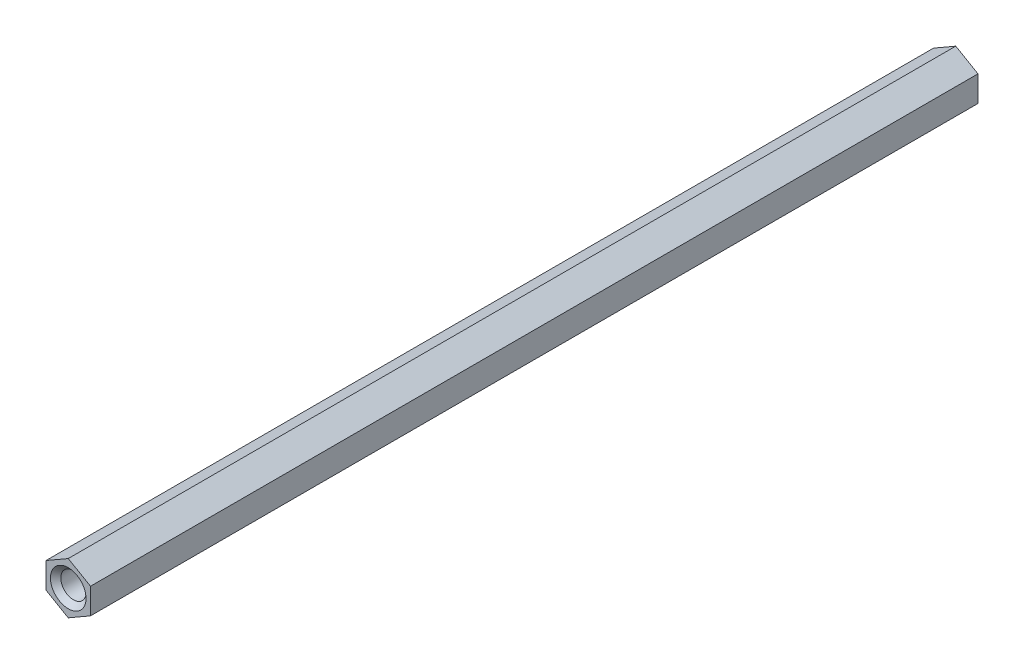
ISO-10303-21;
HEADER;
FILE_DESCRIPTION(('STEP AP214'),'2;1');
FILE_NAME('part.step','',(''),(''),'','','');
FILE_SCHEMA(('AUTOMOTIVE_DESIGN { 1 0 10303 214 1 1 1 1 }'));
ENDSEC;
DATA;
#1=APPLICATION_CONTEXT('core data for automotive mechanical design processes');
#2=APPLICATION_PROTOCOL_DEFINITION('international standard','automotive_design',2000,#1);
#3=PRODUCT_CONTEXT('',#1,'mechanical');
#4=PRODUCT('Part','Part','',(#3));
#5=PRODUCT_RELATED_PRODUCT_CATEGORY('part','',(#4));
#6=PRODUCT_DEFINITION_FORMATION('','',#4);
#7=PRODUCT_DEFINITION_CONTEXT('part definition',#1,'design');
#8=PRODUCT_DEFINITION('design','',#6,#7);
#9=PRODUCT_DEFINITION_SHAPE('','',#8);
#10=(LENGTH_UNIT() NAMED_UNIT(*) SI_UNIT(.MILLI.,.METRE.));
#11=(NAMED_UNIT(*) PLANE_ANGLE_UNIT() SI_UNIT($,.RADIAN.));
#12=(NAMED_UNIT(*) SI_UNIT($,.STERADIAN.) SOLID_ANGLE_UNIT());
#13=UNCERTAINTY_MEASURE_WITH_UNIT(LENGTH_MEASURE(1.E-05),#10,'distance_accuracy_value','');
#14=(GEOMETRIC_REPRESENTATION_CONTEXT(3) GLOBAL_UNCERTAINTY_ASSIGNED_CONTEXT((#13)) GLOBAL_UNIT_ASSIGNED_CONTEXT((#10,
#11,#12)) REPRESENTATION_CONTEXT('',''));
#15=CARTESIAN_POINT('',(0.,0.,0.));
#16=DIRECTION('',(0.,0.,1.));
#17=DIRECTION('',(1.,0.,0.));
#18=AXIS2_PLACEMENT_3D('',#15,#16,#17);
#19=CARTESIAN_POINT('',(0.,0.,95.000000000001));
#20=DIRECTION('',(0.,0.,-1.));
#21=DIRECTION('',(-1.,0.,0.));
#22=AXIS2_PLACEMENT_3D('',#19,#20,#21);
#23=PLANE('',#22);
#24=DIRECTION('',(-0.866025403784439,-0.5,0.));
#25=VECTOR('',#24,1.);
#26=CARTESIAN_POINT('',(-4.7625,2.74963065701559,95.000000000001));
#27=LINE('',#26,#25);
#28=CARTESIAN_POINT('',(0.,5.49926131403118,95.000000000001));
#29=VERTEX_POINT('',#28);
#30=CARTESIAN_POINT('',(-4.7625,2.74963065701559,95.000000000001));
#31=VERTEX_POINT('',#30);
#32=EDGE_CURVE('E163',#29,#31,#27,.T.);
#33=ORIENTED_EDGE('',*,*,#32,.T.);
#34=DIRECTION('',(0.,-1.,0.));
#35=VECTOR('',#34,1.);
#36=CARTESIAN_POINT('',(-4.7625,-2.74963065701559,95.000000000001));
#37=LINE('',#36,#35);
#38=CARTESIAN_POINT('',(-4.7625,-2.74963065701559,95.000000000001));
#39=VERTEX_POINT('',#38);
#40=EDGE_CURVE('E109',#31,#39,#37,.T.);
#41=ORIENTED_EDGE('',*,*,#40,.T.);
#42=DIRECTION('',(0.866025403784439,-0.5,0.));
#43=VECTOR('',#42,1.);
#44=CARTESIAN_POINT('',(0.,-5.49926131403118,95.000000000001));
#45=LINE('',#44,#43);
#46=CARTESIAN_POINT('',(0.,-5.49926131403118,95.000000000001));
#47=VERTEX_POINT('',#46);
#48=EDGE_CURVE('E124',#39,#47,#45,.T.);
#49=ORIENTED_EDGE('',*,*,#48,.T.);
#50=DIRECTION('',(0.866025403784439,0.5,0.));
#51=VECTOR('',#50,1.);
#52=CARTESIAN_POINT('',(4.7625,-2.7496306570156,95.000000000001));
#53=LINE('',#52,#51);
#54=CARTESIAN_POINT('',(4.7625,-2.7496306570156,95.000000000001));
#55=VERTEX_POINT('',#54);
#56=EDGE_CURVE('E118',#47,#55,#53,.T.);
#57=ORIENTED_EDGE('',*,*,#56,.T.);
#58=DIRECTION('',(0.,1.,0.));
#59=VECTOR('',#58,1.);
#60=CARTESIAN_POINT('',(4.7625,2.74963065701559,95.000000000001));
#61=LINE('',#60,#59);
#62=CARTESIAN_POINT('',(4.7625,2.74963065701559,95.000000000001));
#63=VERTEX_POINT('',#62);
#64=EDGE_CURVE('E122',#55,#63,#61,.T.);
#65=ORIENTED_EDGE('',*,*,#64,.T.);
#66=DIRECTION('',(-0.866025403784439,0.5,0.));
#67=VECTOR('',#66,1.);
#68=CARTESIAN_POINT('',(0.,5.49926131403118,95.000000000001));
#69=LINE('',#68,#67);
#70=EDGE_CURVE('E71',#63,#29,#69,.T.);
#71=ORIENTED_EDGE('',*,*,#70,.T.);
#72=EDGE_LOOP('',(#33,#41,#49,#57,#65,#71));
#73=FACE_BOUND('',#72,.T.);
#74=CARTESIAN_POINT('',(0.,0.,95.000000000001));
#75=DIRECTION('',(0.,0.,1.));
#76=DIRECTION('',(1.,0.,0.));
#77=AXIS2_PLACEMENT_3D('',#74,#75,#76);
#78=CIRCLE('',#77,3.81);
#79=CARTESIAN_POINT('',(3.81,0.,95.000000000001));
#80=VERTEX_POINT('',#79);
#81=EDGE_CURVE('E239',#80,#80,#78,.T.);
#82=ORIENTED_EDGE('',*,*,#81,.F.);
#83=EDGE_LOOP('',(#82));
#84=FACE_BOUND('',#83,.T.);
#85=ADVANCED_FACE('F53',(#73,#84),#23,.F.);
#86=CARTESIAN_POINT('',(-4.7625,2.74963065701559,95.000000000001));
#87=DIRECTION('',(0.5,-0.866025403784439,0.));
#88=DIRECTION('',(0.866025403784439,0.5,0.));
#89=AXIS2_PLACEMENT_3D('',#86,#87,#88);
#90=PLANE('',#89);
#91=DIRECTION('',(-0.866025403784439,-0.5,0.));
#92=VECTOR('',#91,1.);
#93=CARTESIAN_POINT('',(-4.7625,2.74963065701559,-95.000000000001));
#94=LINE('',#93,#92);
#95=CARTESIAN_POINT('',(0.,5.49926131403118,-95.000000000001));
#96=VERTEX_POINT('',#95);
#97=CARTESIAN_POINT('',(-4.7625,2.74963065701559,-95.000000000001));
#98=VERTEX_POINT('',#97);
#99=EDGE_CURVE('E146',#96,#98,#94,.T.);
#100=ORIENTED_EDGE('',*,*,#99,.T.);
#101=DIRECTION('',(0.,0.,-1.));
#102=VECTOR('',#101,1.);
#103=CARTESIAN_POINT('',(-4.7625,2.74963065701559,95.000000000001));
#104=LINE('',#103,#102);
#105=EDGE_CURVE('E11',#31,#98,#104,.T.);
#106=ORIENTED_EDGE('',*,*,#105,.F.);
#107=ORIENTED_EDGE('',*,*,#32,.F.);
#108=DIRECTION('',(0.,0.,-1.));
#109=VECTOR('',#108,1.);
#110=CARTESIAN_POINT('',(0.,5.49926131403118,95.000000000001));
#111=LINE('',#110,#109);
#112=EDGE_CURVE('E142',#29,#96,#111,.T.);
#113=ORIENTED_EDGE('',*,*,#112,.T.);
#114=EDGE_LOOP('',(#100,#106,#107,#113));
#115=FACE_BOUND('',#114,.T.);
#116=ADVANCED_FACE('F55',(#115),#90,.F.);
#117=CARTESIAN_POINT('',(-4.7625,-2.74963065701559,95.000000000001));
#118=DIRECTION('',(1.,0.,0.));
#119=DIRECTION('',(0.,1.,0.));
#120=AXIS2_PLACEMENT_3D('',#117,#118,#119);
#121=PLANE('',#120);
#122=DIRECTION('',(0.,-1.,0.));
#123=VECTOR('',#122,1.);
#124=CARTESIAN_POINT('',(-4.7625,-2.74963065701559,-95.000000000001));
#125=LINE('',#124,#123);
#126=CARTESIAN_POINT('',(-4.7625,-2.74963065701559,-95.000000000001));
#127=VERTEX_POINT('',#126);
#128=EDGE_CURVE('E150',#98,#127,#125,.T.);
#129=ORIENTED_EDGE('',*,*,#128,.T.);
#130=DIRECTION('',(0.,0.,-1.));
#131=VECTOR('',#130,1.);
#132=CARTESIAN_POINT('',(-4.7625,-2.74963065701559,95.000000000001));
#133=LINE('',#132,#131);
#134=EDGE_CURVE('E63',#39,#127,#133,.T.);
#135=ORIENTED_EDGE('',*,*,#134,.F.);
#136=ORIENTED_EDGE('',*,*,#40,.F.);
#137=ORIENTED_EDGE('',*,*,#105,.T.);
#138=EDGE_LOOP('',(#129,#135,#136,#137));
#139=FACE_BOUND('',#138,.T.);
#140=ADVANCED_FACE('F197',(#139),#121,.F.);
#141=CARTESIAN_POINT('',(0.,-5.49926131403118,95.000000000001));
#142=DIRECTION('',(0.5,0.866025403784439,0.));
#143=DIRECTION('',(-0.866025403784439,0.5,0.));
#144=AXIS2_PLACEMENT_3D('',#141,#142,#143);
#145=PLANE('',#144);
#146=DIRECTION('',(0.866025403784439,-0.5,0.));
#147=VECTOR('',#146,1.);
#148=CARTESIAN_POINT('',(0.,-5.49926131403118,-95.000000000001));
#149=LINE('',#148,#147);
#150=CARTESIAN_POINT('',(0.,-5.49926131403118,-95.000000000001));
#151=VERTEX_POINT('',#150);
#152=EDGE_CURVE('E154',#127,#151,#149,.T.);
#153=ORIENTED_EDGE('',*,*,#152,.T.);
#154=DIRECTION('',(0.,0.,-1.));
#155=VECTOR('',#154,1.);
#156=CARTESIAN_POINT('',(0.,-5.49926131403118,95.000000000001));
#157=LINE('',#156,#155);
#158=EDGE_CURVE('E135',#47,#151,#157,.T.);
#159=ORIENTED_EDGE('',*,*,#158,.F.);
#160=ORIENTED_EDGE('',*,*,#48,.F.);
#161=ORIENTED_EDGE('',*,*,#134,.T.);
#162=EDGE_LOOP('',(#153,#159,#160,#161));
#163=FACE_BOUND('',#162,.T.);
#164=ADVANCED_FACE('F173',(#163),#145,.F.);
#165=CARTESIAN_POINT('',(4.7625,-2.7496306570156,95.000000000001));
#166=DIRECTION('',(-0.5,0.866025403784439,0.));
#167=DIRECTION('',(-0.866025403784439,-0.5,0.));
#168=AXIS2_PLACEMENT_3D('',#165,#166,#167);
#169=PLANE('',#168);
#170=DIRECTION('',(0.866025403784439,0.5,0.));
#171=VECTOR('',#170,1.);
#172=CARTESIAN_POINT('',(4.7625,-2.7496306570156,-95.000000000001));
#173=LINE('',#172,#171);
#174=CARTESIAN_POINT('',(4.7625,-2.7496306570156,-95.000000000001));
#175=VERTEX_POINT('',#174);
#176=EDGE_CURVE('E133',#151,#175,#173,.T.);
#177=ORIENTED_EDGE('',*,*,#176,.T.);
#178=DIRECTION('',(0.,0.,-1.));
#179=VECTOR('',#178,1.);
#180=CARTESIAN_POINT('',(4.7625,-2.7496306570156,95.000000000001));
#181=LINE('',#180,#179);
#182=EDGE_CURVE('E130',#55,#175,#181,.T.);
#183=ORIENTED_EDGE('',*,*,#182,.F.);
#184=ORIENTED_EDGE('',*,*,#56,.F.);
#185=ORIENTED_EDGE('',*,*,#158,.T.);
#186=EDGE_LOOP('',(#177,#183,#184,#185));
#187=FACE_BOUND('',#186,.T.);
#188=ADVANCED_FACE('F131',(#187),#169,.F.);
#189=CARTESIAN_POINT('',(4.7625,2.74963065701559,95.000000000001));
#190=DIRECTION('',(-1.,0.,0.));
#191=DIRECTION('',(0.,0.,1.));
#192=AXIS2_PLACEMENT_3D('',#189,#190,#191);
#193=PLANE('',#192);
#194=DIRECTION('',(0.,1.,0.));
#195=VECTOR('',#194,1.);
#196=CARTESIAN_POINT('',(4.7625,2.74963065701559,-95.000000000001));
#197=LINE('',#196,#195);
#198=CARTESIAN_POINT('',(4.7625,2.74963065701559,-95.000000000001));
#199=VERTEX_POINT('',#198);
#200=EDGE_CURVE('E95',#175,#199,#197,.T.);
#201=ORIENTED_EDGE('',*,*,#200,.T.);
#202=DIRECTION('',(0.,0.,-1.));
#203=VECTOR('',#202,1.);
#204=CARTESIAN_POINT('',(4.7625,2.74963065701559,95.000000000001));
#205=LINE('',#204,#203);
#206=EDGE_CURVE('E136',#63,#199,#205,.T.);
#207=ORIENTED_EDGE('',*,*,#206,.F.);
#208=ORIENTED_EDGE('',*,*,#64,.F.);
#209=ORIENTED_EDGE('',*,*,#182,.T.);
#210=EDGE_LOOP('',(#201,#207,#208,#209));
#211=FACE_BOUND('',#210,.T.);
#212=ADVANCED_FACE('F138',(#211),#193,.F.);
#213=CARTESIAN_POINT('',(0.,5.49926131403118,95.000000000001));
#214=DIRECTION('',(-0.5,-0.866025403784439,0.));
#215=DIRECTION('',(0.866025403784439,-0.5,0.));
#216=AXIS2_PLACEMENT_3D('',#213,#214,#215);
#217=PLANE('',#216);
#218=DIRECTION('',(-0.866025403784439,0.5,0.));
#219=VECTOR('',#218,1.);
#220=CARTESIAN_POINT('',(0.,5.49926131403118,-95.000000000001));
#221=LINE('',#220,#219);
#222=EDGE_CURVE('E101',#199,#96,#221,.T.);
#223=ORIENTED_EDGE('',*,*,#222,.T.);
#224=ORIENTED_EDGE('',*,*,#112,.F.);
#225=ORIENTED_EDGE('',*,*,#70,.F.);
#226=ORIENTED_EDGE('',*,*,#206,.T.);
#227=EDGE_LOOP('',(#223,#224,#225,#226));
#228=FACE_BOUND('',#227,.T.);
#229=ADVANCED_FACE('F180',(#228),#217,.F.);
#230=CARTESIAN_POINT('',(0.,0.,-95.000000000001));
#231=DIRECTION('',(0.,0.,-1.));
#232=DIRECTION('',(-1.,0.,0.));
#233=AXIS2_PLACEMENT_3D('',#230,#231,#232);
#234=PLANE('',#233);
#235=CARTESIAN_POINT('',(0.,0.,-95.000000000001));
#236=DIRECTION('',(0.,0.,-1.));
#237=DIRECTION('',(-1.,0.,0.));
#238=AXIS2_PLACEMENT_3D('',#235,#236,#237);
#239=CIRCLE('',#238,3.81);
#240=CARTESIAN_POINT('',(-3.81,0.,-95.000000000001));
#241=VERTEX_POINT('',#240);
#242=EDGE_CURVE('E229',#241,#241,#239,.T.);
#243=ORIENTED_EDGE('',*,*,#242,.F.);
#244=EDGE_LOOP('',(#243));
#245=FACE_BOUND('',#244,.T.);
#246=ORIENTED_EDGE('',*,*,#99,.F.);
#247=ORIENTED_EDGE('',*,*,#222,.F.);
#248=ORIENTED_EDGE('',*,*,#200,.F.);
#249=ORIENTED_EDGE('',*,*,#176,.F.);
#250=ORIENTED_EDGE('',*,*,#152,.F.);
#251=ORIENTED_EDGE('',*,*,#128,.F.);
#252=EDGE_LOOP('',(#246,#247,#248,#249,#250,#251));
#253=FACE_BOUND('',#252,.T.);
#254=ADVANCED_FACE('F176',(#245,#253),#234,.T.);
#255=CARTESIAN_POINT('',(0.,0.,79.760000000001));
#256=DIRECTION('',(0.,0.,1.));
#257=DIRECTION('',(1.,0.,0.));
#258=AXIS2_PLACEMENT_3D('',#255,#256,#257);
#259=CONICAL_SURFACE('',#258,2.7051,1.02974425867665);
#260=CARTESIAN_POINT('',(0.,0.,78.1346119394696));
#261=VERTEX_POINT('',#260);
#262=VERTEX_LOOP('',#261);
#263=FACE_BOUND('',#262,.T.);
#264=CARTESIAN_POINT('',(0.,0.,79.760000000001));
#265=DIRECTION('',(0.,0.,1.));
#266=DIRECTION('',(1.,0.,0.));
#267=AXIS2_PLACEMENT_3D('',#264,#265,#266);
#268=CIRCLE('',#267,2.7051);
#269=CARTESIAN_POINT('',(2.7051,0.,79.760000000001));
#270=VERTEX_POINT('',#269);
#271=EDGE_CURVE('E151',#270,#270,#268,.T.);
#272=ORIENTED_EDGE('',*,*,#271,.T.);
#273=EDGE_LOOP('',(#272));
#274=FACE_BOUND('',#273,.T.);
#275=ADVANCED_FACE('F188',(#263,#274),#259,.F.);
#276=CARTESIAN_POINT('',(0.,0.,95.000000000001));
#277=DIRECTION('',(0.,0.,1.));
#278=DIRECTION('',(1.,0.,0.));
#279=AXIS2_PLACEMENT_3D('',#276,#277,#278);
#280=CYLINDRICAL_SURFACE('',#279,2.7051);
#281=ORIENTED_EDGE('',*,*,#271,.F.);
#282=EDGE_LOOP('',(#281));
#283=FACE_BOUND('',#282,.T.);
#284=CARTESIAN_POINT('',(0.,0.,93.895100000001));
#285=DIRECTION('',(0.,0.,1.));
#286=DIRECTION('',(1.,0.,0.));
#287=AXIS2_PLACEMENT_3D('',#284,#285,#286);
#288=CIRCLE('',#287,2.7051);
#289=CARTESIAN_POINT('',(2.7051,0.,93.895100000001));
#290=VERTEX_POINT('',#289);
#291=EDGE_CURVE('E243',#290,#290,#288,.T.);
#292=ORIENTED_EDGE('',*,*,#291,.T.);
#293=EDGE_LOOP('',(#292));
#294=FACE_BOUND('',#293,.T.);
#295=ADVANCED_FACE('F200',(#283,#294),#280,.F.);
#296=CARTESIAN_POINT('',(0.,0.,95.000000000001));
#297=DIRECTION('',(0.,0.,1.));
#298=DIRECTION('',(1.,0.,0.));
#299=AXIS2_PLACEMENT_3D('',#296,#297,#298);
#300=CONICAL_SURFACE('',#299,3.81,0.785398163397453);
#301=ORIENTED_EDGE('',*,*,#291,.F.);
#302=EDGE_LOOP('',(#301));
#303=FACE_BOUND('',#302,.T.);
#304=ORIENTED_EDGE('',*,*,#81,.T.);
#305=EDGE_LOOP('',(#304));
#306=FACE_BOUND('',#305,.T.);
#307=ADVANCED_FACE('F204',(#303,#306),#300,.F.);
#308=CARTESIAN_POINT('',(0.,0.,-77.766100000001));
#309=DIRECTION('',(0.,0.,-1.));
#310=DIRECTION('',(-1.,0.,0.));
#311=AXIS2_PLACEMENT_3D('',#308,#309,#310);
#312=CONICAL_SURFACE('',#311,2.7051,1.02974425867665);
#313=CARTESIAN_POINT('',(0.,0.,-76.1407119394695));
#314=VERTEX_POINT('',#313);
#315=VERTEX_LOOP('',#314);
#316=FACE_BOUND('',#315,.T.);
#317=CARTESIAN_POINT('',(0.,0.,-77.766100000001));
#318=DIRECTION('',(0.,0.,-1.));
#319=DIRECTION('',(-1.,0.,0.));
#320=AXIS2_PLACEMENT_3D('',#317,#318,#319);
#321=CIRCLE('',#320,2.7051);
#322=CARTESIAN_POINT('',(-2.7051,0.,-77.766100000001));
#323=VERTEX_POINT('',#322);
#324=EDGE_CURVE('E233',#323,#323,#321,.T.);
#325=ORIENTED_EDGE('',*,*,#324,.T.);
#326=EDGE_LOOP('',(#325));
#327=FACE_BOUND('',#326,.T.);
#328=ADVANCED_FACE('F208',(#316,#327),#312,.F.);
#329=CARTESIAN_POINT('',(0.,0.,-95.000000000001));
#330=DIRECTION('',(0.,0.,-1.));
#331=DIRECTION('',(-1.,0.,0.));
#332=AXIS2_PLACEMENT_3D('',#329,#330,#331);
#333=CYLINDRICAL_SURFACE('',#332,2.7051);
#334=ORIENTED_EDGE('',*,*,#324,.F.);
#335=EDGE_LOOP('',(#334));
#336=FACE_BOUND('',#335,.T.);
#337=CARTESIAN_POINT('',(0.,0.,-93.895100000001));
#338=DIRECTION('',(0.,0.,-1.));
#339=DIRECTION('',(-1.,0.,0.));
#340=AXIS2_PLACEMENT_3D('',#337,#338,#339);
#341=CIRCLE('',#340,2.7051);
#342=CARTESIAN_POINT('',(-2.7051,0.,-93.895100000001));
#343=VERTEX_POINT('',#342);
#344=EDGE_CURVE('E226',#343,#343,#341,.T.);
#345=ORIENTED_EDGE('',*,*,#344,.T.);
#346=EDGE_LOOP('',(#345));
#347=FACE_BOUND('',#346,.T.);
#348=ADVANCED_FACE('F212',(#336,#347),#333,.F.);
#349=CARTESIAN_POINT('',(0.,0.,-95.000000000001));
#350=DIRECTION('',(0.,0.,-1.));
#351=DIRECTION('',(-1.,0.,0.));
#352=AXIS2_PLACEMENT_3D('',#349,#350,#351);
#353=CONICAL_SURFACE('',#352,3.81,0.785398163397452);
#354=ORIENTED_EDGE('',*,*,#344,.F.);
#355=EDGE_LOOP('',(#354));
#356=FACE_BOUND('',#355,.T.);
#357=ORIENTED_EDGE('',*,*,#242,.T.);
#358=EDGE_LOOP('',(#357));
#359=FACE_BOUND('',#358,.T.);
#360=ADVANCED_FACE('F216',(#356,#359),#353,.F.);
#361=CLOSED_SHELL('',(#85,#116,#140,#164,#188,#212,#229,#254,#275,#295,#307,#328,#348,#360));
#362=MANIFOLD_SOLID_BREP('B2',#361);
#363=ADVANCED_BREP_SHAPE_REPRESENTATION('',(#18,#362),#14);
#364=SHAPE_DEFINITION_REPRESENTATION(#9,#363);
ENDSEC;
END-ISO-10303-21;
